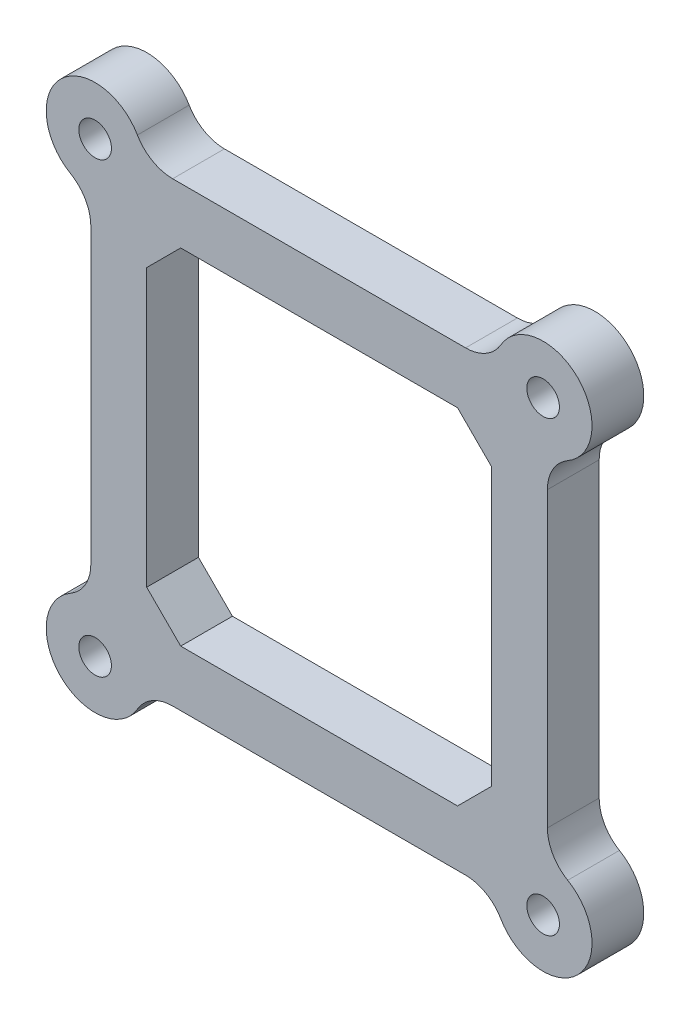
ISO-10303-21;
HEADER;
FILE_DESCRIPTION(('STEP AP214'),'2;1');
FILE_NAME('part.step','',(''),(''),'','','');
FILE_SCHEMA(('AUTOMOTIVE_DESIGN { 1 0 10303 214 1 1 1 1 }'));
ENDSEC;
DATA;
#1=APPLICATION_CONTEXT('core data for automotive mechanical design processes');
#2=APPLICATION_PROTOCOL_DEFINITION('international standard','automotive_design',2000,#1);
#3=PRODUCT_CONTEXT('',#1,'mechanical');
#4=PRODUCT('Part','Part','',(#3));
#5=PRODUCT_RELATED_PRODUCT_CATEGORY('part','',(#4));
#6=PRODUCT_DEFINITION_FORMATION('','',#4);
#7=PRODUCT_DEFINITION_CONTEXT('part definition',#1,'design');
#8=PRODUCT_DEFINITION('design','',#6,#7);
#9=PRODUCT_DEFINITION_SHAPE('','',#8);
#10=(LENGTH_UNIT() NAMED_UNIT(*) SI_UNIT(.MILLI.,.METRE.));
#11=(NAMED_UNIT(*) PLANE_ANGLE_UNIT() SI_UNIT($,.RADIAN.));
#12=(NAMED_UNIT(*) SI_UNIT($,.STERADIAN.) SOLID_ANGLE_UNIT());
#13=UNCERTAINTY_MEASURE_WITH_UNIT(LENGTH_MEASURE(1.E-05),#10,'distance_accuracy_value','');
#14=(GEOMETRIC_REPRESENTATION_CONTEXT(3) GLOBAL_UNCERTAINTY_ASSIGNED_CONTEXT((#13)) GLOBAL_UNIT_ASSIGNED_CONTEXT((#10,
#11,#12)) REPRESENTATION_CONTEXT('',''));
#15=CARTESIAN_POINT('',(0.,0.,0.));
#16=DIRECTION('',(0.,0.,1.));
#17=DIRECTION('',(1.,0.,0.));
#18=AXIS2_PLACEMENT_3D('',#15,#16,#17);
#19=CARTESIAN_POINT('',(0.,0.,6.35));
#20=DIRECTION('',(0.,0.,-1.));
#21=DIRECTION('',(-1.,0.,0.));
#22=AXIS2_PLACEMENT_3D('',#19,#20,#21);
#23=PLANE('',#22);
#24=CARTESIAN_POINT('',(-27.4766588878334,-27.4766588878335,6.35));
#25=DIRECTION('',(0.,0.,1.));
#26=DIRECTION('',(1.,0.,0.));
#27=AXIS2_PLACEMENT_3D('',#24,#25,#26);
#28=CIRCLE('',#27,2.00000000000001);
#29=CARTESIAN_POINT('',(-25.4766588878334,-27.4766588878335,6.35));
#30=VERTEX_POINT('',#29);
#31=EDGE_CURVE('E761',#30,#30,#28,.T.);
#32=ORIENTED_EDGE('',*,*,#31,.F.);
#33=EDGE_LOOP('',(#32));
#34=FACE_BOUND('',#33,.T.);
#35=CARTESIAN_POINT('',(27.4766588878334,-27.4766588878335,6.35));
#36=DIRECTION('',(0.,0.,1.));
#37=DIRECTION('',(1.,0.,0.));
#38=AXIS2_PLACEMENT_3D('',#35,#36,#37);
#39=CIRCLE('',#38,2.00000000000001);
#40=CARTESIAN_POINT('',(29.4766588878334,-27.4766588878335,6.35));
#41=VERTEX_POINT('',#40);
#42=EDGE_CURVE('E753',#41,#41,#39,.T.);
#43=ORIENTED_EDGE('',*,*,#42,.F.);
#44=EDGE_LOOP('',(#43));
#45=FACE_BOUND('',#44,.T.);
#46=CARTESIAN_POINT('',(27.4766588878334,27.4766588878335,6.35));
#47=DIRECTION('',(0.,0.,1.));
#48=DIRECTION('',(1.,0.,0.));
#49=AXIS2_PLACEMENT_3D('',#46,#47,#48);
#50=CIRCLE('',#49,2.00000000000001);
#51=CARTESIAN_POINT('',(29.4766588878334,27.4766588878335,6.35));
#52=VERTEX_POINT('',#51);
#53=EDGE_CURVE('E747',#52,#52,#50,.T.);
#54=ORIENTED_EDGE('',*,*,#53,.F.);
#55=EDGE_LOOP('',(#54));
#56=FACE_BOUND('',#55,.T.);
#57=CARTESIAN_POINT('',(-27.4766588878334,27.4766588878335,6.35));
#58=DIRECTION('',(0.,0.,1.));
#59=DIRECTION('',(1.,0.,0.));
#60=AXIS2_PLACEMENT_3D('',#57,#58,#59);
#61=CIRCLE('',#60,2.00000000000001);
#62=CARTESIAN_POINT('',(-25.4766588878334,27.4766588878335,6.35));
#63=VERTEX_POINT('',#62);
#64=EDGE_CURVE('E421',#63,#63,#61,.T.);
#65=ORIENTED_EDGE('',*,*,#64,.F.);
#66=EDGE_LOOP('',(#65));
#67=FACE_BOUND('',#66,.T.);
#68=CARTESIAN_POINT('',(-27.4766588878334,-27.4766588878335,6.35));
#69=DIRECTION('',(0.,0.,-1.));
#70=DIRECTION('',(-1.,0.,0.));
#71=AXIS2_PLACEMENT_3D('',#68,#69,#70);
#72=CIRCLE('',#71,6.00000000000001);
#73=CARTESIAN_POINT('',(-22.2895835698034,-30.4923262509695,6.35));
#74=VERTEX_POINT('',#73);
#75=CARTESIAN_POINT('',(-30.4923262509695,-22.2895835698035,6.35));
#76=VERTEX_POINT('',#75);
#77=EDGE_CURVE('E389',#74,#76,#72,.T.);
#78=ORIENTED_EDGE('',*,*,#77,.F.);
#79=CARTESIAN_POINT('',(-17.9670208047784,-33.0053823869162,6.35));
#80=DIRECTION('',(0.,0.,-1.));
#81=DIRECTION('',(-1.,0.,0.));
#82=AXIS2_PLACEMENT_3D('',#79,#80,#81);
#83=CIRCLE('',#82,5.);
#84=CARTESIAN_POINT('',(-17.9670208047784,-28.0053823869162,6.35));
#85=VERTEX_POINT('',#84);
#86=EDGE_CURVE('E344',#74,#85,#83,.T.);
#87=ORIENTED_EDGE('',*,*,#86,.T.);
#88=DIRECTION('',(1.,0.,0.));
#89=VECTOR('',#88,1.);
#90=CARTESIAN_POINT('',(21.5,-28.0053823869162,6.35));
#91=LINE('',#90,#89);
#92=CARTESIAN_POINT('',(17.9670208047784,-28.0053823869162,6.35));
#93=VERTEX_POINT('',#92);
#94=EDGE_CURVE('E270',#85,#93,#91,.T.);
#95=ORIENTED_EDGE('',*,*,#94,.T.);
#96=CARTESIAN_POINT('',(17.9670208047784,-33.0053823869162,6.35));
#97=DIRECTION('',(0.,0.,-1.));
#98=DIRECTION('',(-1.,0.,0.));
#99=AXIS2_PLACEMENT_3D('',#96,#97,#98);
#100=CIRCLE('',#99,5.);
#101=CARTESIAN_POINT('',(22.2895835698034,-30.4923262509695,6.35));
#102=VERTEX_POINT('',#101);
#103=EDGE_CURVE('E340',#93,#102,#100,.T.);
#104=ORIENTED_EDGE('',*,*,#103,.T.);
#105=CARTESIAN_POINT('',(27.4766588878334,-27.4766588878335,6.35));
#106=DIRECTION('',(0.,0.,-1.));
#107=DIRECTION('',(-1.,0.,0.));
#108=AXIS2_PLACEMENT_3D('',#105,#106,#107);
#109=CIRCLE('',#108,6.00000000000001);
#110=CARTESIAN_POINT('',(30.4923262509695,-22.2895835698035,6.35));
#111=VERTEX_POINT('',#110);
#112=EDGE_CURVE('E416',#102,#111,#109,.F.);
#113=ORIENTED_EDGE('',*,*,#112,.T.);
#114=CARTESIAN_POINT('',(33.0053823869162,-17.9670208047785,6.35));
#115=DIRECTION('',(0.,0.,-1.));
#116=DIRECTION('',(-1.,0.,0.));
#117=AXIS2_PLACEMENT_3D('',#114,#115,#116);
#118=CIRCLE('',#117,5.);
#119=CARTESIAN_POINT('',(28.0053823869162,-17.9670208047785,6.35));
#120=VERTEX_POINT('',#119);
#121=EDGE_CURVE('E336',#111,#120,#118,.T.);
#122=ORIENTED_EDGE('',*,*,#121,.T.);
#123=DIRECTION('',(0.,1.,0.));
#124=VECTOR('',#123,1.);
#125=CARTESIAN_POINT('',(28.0053823869162,21.5,6.35));
#126=LINE('',#125,#124);
#127=CARTESIAN_POINT('',(28.0053823869162,17.9670208047785,6.35));
#128=VERTEX_POINT('',#127);
#129=EDGE_CURVE('E273',#120,#128,#126,.T.);
#130=ORIENTED_EDGE('',*,*,#129,.T.);
#131=CARTESIAN_POINT('',(33.0053823869162,17.9670208047785,6.35));
#132=DIRECTION('',(0.,0.,-1.));
#133=DIRECTION('',(-1.,0.,0.));
#134=AXIS2_PLACEMENT_3D('',#131,#132,#133);
#135=CIRCLE('',#134,5.);
#136=CARTESIAN_POINT('',(30.4923262509695,22.2895835698035,6.35));
#137=VERTEX_POINT('',#136);
#138=EDGE_CURVE('E332',#128,#137,#135,.T.);
#139=ORIENTED_EDGE('',*,*,#138,.T.);
#140=CARTESIAN_POINT('',(27.4766588878334,27.4766588878335,6.35));
#141=DIRECTION('',(0.,0.,-1.));
#142=DIRECTION('',(-1.,0.,0.));
#143=AXIS2_PLACEMENT_3D('',#140,#141,#142);
#144=CIRCLE('',#143,6.00000000000001);
#145=CARTESIAN_POINT('',(22.2895835698034,30.4923262509695,6.35));
#146=VERTEX_POINT('',#145);
#147=EDGE_CURVE('E239',#146,#137,#144,.T.);
#148=ORIENTED_EDGE('',*,*,#147,.F.);
#149=CARTESIAN_POINT('',(17.9670208047784,33.0053823869162,6.35));
#150=DIRECTION('',(0.,0.,-1.));
#151=DIRECTION('',(-1.,0.,0.));
#152=AXIS2_PLACEMENT_3D('',#149,#150,#151);
#153=CIRCLE('',#152,5.);
#154=CARTESIAN_POINT('',(17.9670208047784,28.0053823869162,6.35));
#155=VERTEX_POINT('',#154);
#156=EDGE_CURVE('E11',#146,#155,#153,.T.);
#157=ORIENTED_EDGE('',*,*,#156,.T.);
#158=DIRECTION('',(-1.,0.,0.));
#159=VECTOR('',#158,1.);
#160=CARTESIAN_POINT('',(-21.5,28.0053823869162,6.35));
#161=LINE('',#160,#159);
#162=CARTESIAN_POINT('',(-17.9670208047784,28.0053823869162,6.35));
#163=VERTEX_POINT('',#162);
#164=EDGE_CURVE('E277',#155,#163,#161,.T.);
#165=ORIENTED_EDGE('',*,*,#164,.T.);
#166=CARTESIAN_POINT('',(-17.9670208047784,33.0053823869162,6.35));
#167=DIRECTION('',(0.,0.,-1.));
#168=DIRECTION('',(-1.,0.,0.));
#169=AXIS2_PLACEMENT_3D('',#166,#167,#168);
#170=CIRCLE('',#169,5.);
#171=CARTESIAN_POINT('',(-22.2895835698034,30.4923262509695,6.35));
#172=VERTEX_POINT('',#171);
#173=EDGE_CURVE('E356',#163,#172,#170,.T.);
#174=ORIENTED_EDGE('',*,*,#173,.T.);
#175=CARTESIAN_POINT('',(-27.4766588878334,27.4766588878335,6.35));
#176=DIRECTION('',(0.,0.,-1.));
#177=DIRECTION('',(-1.,0.,0.));
#178=AXIS2_PLACEMENT_3D('',#175,#176,#177);
#179=CIRCLE('',#178,6.00000000000001);
#180=CARTESIAN_POINT('',(-30.4923262509695,22.2895835698035,6.35));
#181=VERTEX_POINT('',#180);
#182=EDGE_CURVE('E372',#172,#181,#179,.F.);
#183=ORIENTED_EDGE('',*,*,#182,.T.);
#184=CARTESIAN_POINT('',(-33.0053823869162,17.9670208047785,6.35));
#185=DIRECTION('',(0.,0.,-1.));
#186=DIRECTION('',(-1.,0.,0.));
#187=AXIS2_PLACEMENT_3D('',#184,#185,#186);
#188=CIRCLE('',#187,5.);
#189=CARTESIAN_POINT('',(-28.0053823869162,17.9670208047785,6.35));
#190=VERTEX_POINT('',#189);
#191=EDGE_CURVE('E352',#181,#190,#188,.T.);
#192=ORIENTED_EDGE('',*,*,#191,.T.);
#193=DIRECTION('',(0.,-1.,0.));
#194=VECTOR('',#193,1.);
#195=CARTESIAN_POINT('',(-28.0053823869162,-21.5,6.35));
#196=LINE('',#195,#194);
#197=CARTESIAN_POINT('',(-28.0053823869162,-17.9670208047785,6.35));
#198=VERTEX_POINT('',#197);
#199=EDGE_CURVE('E279',#190,#198,#196,.T.);
#200=ORIENTED_EDGE('',*,*,#199,.T.);
#201=CARTESIAN_POINT('',(-33.0053823869162,-17.9670208047785,6.35));
#202=DIRECTION('',(0.,0.,-1.));
#203=DIRECTION('',(-1.,0.,0.));
#204=AXIS2_PLACEMENT_3D('',#201,#202,#203);
#205=CIRCLE('',#204,5.);
#206=EDGE_CURVE('E348',#198,#76,#205,.T.);
#207=ORIENTED_EDGE('',*,*,#206,.T.);
#208=EDGE_LOOP('',(#78,#87,#95,#104,#113,#122,#130,#139,#148,#157,#165,#174,#183,#192,#200,#207));
#209=FACE_BOUND('',#208,.T.);
#210=DIRECTION('',(1.,0.,0.));
#211=VECTOR('',#210,1.);
#212=CARTESIAN_POINT('',(16.9780699909994,-21.15,6.35));
#213=LINE('',#212,#211);
#214=CARTESIAN_POINT('',(-16.9780699909994,-21.15,6.35));
#215=VERTEX_POINT('',#214);
#216=CARTESIAN_POINT('',(16.9780699909994,-21.15,6.35));
#217=VERTEX_POINT('',#216);
#218=EDGE_CURVE('E198',#215,#217,#213,.T.);
#219=ORIENTED_EDGE('',*,*,#218,.F.);
#220=DIRECTION('',(0.707106781186548,-0.707106781186548,0.));
#221=VECTOR('',#220,1.);
#222=CARTESIAN_POINT('',(-16.9780699909994,-21.15,6.35));
#223=LINE('',#222,#221);
#224=CARTESIAN_POINT('',(-21.15,-16.9780699909994,6.35));
#225=VERTEX_POINT('',#224);
#226=EDGE_CURVE('E235',#225,#215,#223,.T.);
#227=ORIENTED_EDGE('',*,*,#226,.F.);
#228=DIRECTION('',(0.,-1.,0.));
#229=VECTOR('',#228,1.);
#230=CARTESIAN_POINT('',(-21.15,-16.9780699909994,6.35));
#231=LINE('',#230,#229);
#232=CARTESIAN_POINT('',(-21.15,16.9780699909994,6.35));
#233=VERTEX_POINT('',#232);
#234=EDGE_CURVE('E232',#233,#225,#231,.T.);
#235=ORIENTED_EDGE('',*,*,#234,.F.);
#236=DIRECTION('',(-0.707106781186548,-0.707106781186548,0.));
#237=VECTOR('',#236,1.);
#238=CARTESIAN_POINT('',(-21.15,16.9780699909994,6.35));
#239=LINE('',#238,#237);
#240=CARTESIAN_POINT('',(-16.9780699909994,21.15,6.35));
#241=VERTEX_POINT('',#240);
#242=EDGE_CURVE('E230',#241,#233,#239,.T.);
#243=ORIENTED_EDGE('',*,*,#242,.F.);
#244=DIRECTION('',(-1.,0.,0.));
#245=VECTOR('',#244,1.);
#246=CARTESIAN_POINT('',(-16.9780699909994,21.15,6.35));
#247=LINE('',#246,#245);
#248=CARTESIAN_POINT('',(16.9780699909994,21.15,6.35));
#249=VERTEX_POINT('',#248);
#250=EDGE_CURVE('E228',#249,#241,#247,.T.);
#251=ORIENTED_EDGE('',*,*,#250,.F.);
#252=DIRECTION('',(-0.707106781186548,0.707106781186548,0.));
#253=VECTOR('',#252,1.);
#254=CARTESIAN_POINT('',(16.9780699909994,21.15,6.35));
#255=LINE('',#254,#253);
#256=CARTESIAN_POINT('',(21.15,16.9780699909994,6.35));
#257=VERTEX_POINT('',#256);
#258=EDGE_CURVE('E223',#257,#249,#255,.T.);
#259=ORIENTED_EDGE('',*,*,#258,.F.);
#260=DIRECTION('',(0.,1.,0.));
#261=VECTOR('',#260,1.);
#262=CARTESIAN_POINT('',(21.15,16.9780699909994,6.35));
#263=LINE('',#262,#261);
#264=CARTESIAN_POINT('',(21.15,-16.9780699909994,6.35));
#265=VERTEX_POINT('',#264);
#266=EDGE_CURVE('E221',#265,#257,#263,.T.);
#267=ORIENTED_EDGE('',*,*,#266,.F.);
#268=DIRECTION('',(0.707106781186548,0.707106781186548,0.));
#269=VECTOR('',#268,1.);
#270=CARTESIAN_POINT('',(21.15,-16.9780699909994,6.35));
#271=LINE('',#270,#269);
#272=EDGE_CURVE('E208',#217,#265,#271,.T.);
#273=ORIENTED_EDGE('',*,*,#272,.F.);
#274=EDGE_LOOP('',(#219,#227,#235,#243,#251,#259,#267,#273));
#275=FACE_BOUND('',#274,.T.);
#276=ADVANCED_FACE('F36',(#34,#45,#56,#67,#209,#275),#23,.F.);
#277=CARTESIAN_POINT('',(0.,0.,0.));
#278=DIRECTION('',(0.,0.,-1.));
#279=DIRECTION('',(-1.,0.,0.));
#280=AXIS2_PLACEMENT_3D('',#277,#278,#279);
#281=PLANE('',#280);
#282=CARTESIAN_POINT('',(-27.4766588878334,-27.4766588878335,0.));
#283=DIRECTION('',(0.,0.,1.));
#284=DIRECTION('',(1.,0.,0.));
#285=AXIS2_PLACEMENT_3D('',#282,#283,#284);
#286=CIRCLE('',#285,2.00000000000001);
#287=CARTESIAN_POINT('',(-25.4766588878334,-27.4766588878335,0.));
#288=VERTEX_POINT('',#287);
#289=EDGE_CURVE('E758',#288,#288,#286,.T.);
#290=ORIENTED_EDGE('',*,*,#289,.T.);
#291=EDGE_LOOP('',(#290));
#292=FACE_BOUND('',#291,.T.);
#293=CARTESIAN_POINT('',(27.4766588878334,-27.4766588878335,0.));
#294=DIRECTION('',(0.,0.,1.));
#295=DIRECTION('',(1.,0.,0.));
#296=AXIS2_PLACEMENT_3D('',#293,#294,#295);
#297=CIRCLE('',#296,2.00000000000001);
#298=CARTESIAN_POINT('',(29.4766588878334,-27.4766588878335,0.));
#299=VERTEX_POINT('',#298);
#300=EDGE_CURVE('E749',#299,#299,#297,.T.);
#301=ORIENTED_EDGE('',*,*,#300,.T.);
#302=EDGE_LOOP('',(#301));
#303=FACE_BOUND('',#302,.T.);
#304=CARTESIAN_POINT('',(27.4766588878334,27.4766588878335,0.));
#305=DIRECTION('',(0.,0.,1.));
#306=DIRECTION('',(1.,0.,0.));
#307=AXIS2_PLACEMENT_3D('',#304,#305,#306);
#308=CIRCLE('',#307,2.00000000000001);
#309=CARTESIAN_POINT('',(29.4766588878334,27.4766588878335,0.));
#310=VERTEX_POINT('',#309);
#311=EDGE_CURVE('E744',#310,#310,#308,.T.);
#312=ORIENTED_EDGE('',*,*,#311,.T.);
#313=EDGE_LOOP('',(#312));
#314=FACE_BOUND('',#313,.T.);
#315=CARTESIAN_POINT('',(-27.4766588878334,27.4766588878335,0.));
#316=DIRECTION('',(0.,0.,1.));
#317=DIRECTION('',(1.,0.,0.));
#318=AXIS2_PLACEMENT_3D('',#315,#316,#317);
#319=CIRCLE('',#318,2.00000000000001);
#320=CARTESIAN_POINT('',(-25.4766588878334,27.4766588878335,0.));
#321=VERTEX_POINT('',#320);
#322=EDGE_CURVE('E417',#321,#321,#319,.T.);
#323=ORIENTED_EDGE('',*,*,#322,.T.);
#324=EDGE_LOOP('',(#323));
#325=FACE_BOUND('',#324,.T.);
#326=DIRECTION('',(0.,1.,0.));
#327=VECTOR('',#326,1.);
#328=CARTESIAN_POINT('',(28.0053823869162,21.5,0.));
#329=LINE('',#328,#327);
#330=CARTESIAN_POINT('',(28.0053823869162,-17.9670208047785,0.));
#331=VERTEX_POINT('',#330);
#332=CARTESIAN_POINT('',(28.0053823869162,17.9670208047785,0.));
#333=VERTEX_POINT('',#332);
#334=EDGE_CURVE('E285',#331,#333,#329,.T.);
#335=ORIENTED_EDGE('',*,*,#334,.F.);
#336=CARTESIAN_POINT('',(33.0053823869162,-17.9670208047785,0.));
#337=DIRECTION('',(0.,0.,-1.));
#338=DIRECTION('',(-1.,0.,0.));
#339=AXIS2_PLACEMENT_3D('',#336,#337,#338);
#340=CIRCLE('',#339,5.);
#341=CARTESIAN_POINT('',(30.4923262509695,-22.2895835698035,0.));
#342=VERTEX_POINT('',#341);
#343=EDGE_CURVE('E334',#331,#342,#340,.F.);
#344=ORIENTED_EDGE('',*,*,#343,.T.);
#345=CARTESIAN_POINT('',(27.4766588878334,-27.4766588878335,0.));
#346=DIRECTION('',(0.,0.,-1.));
#347=DIRECTION('',(1.,0.,0.));
#348=AXIS2_PLACEMENT_3D('',#345,#346,#347);
#349=CIRCLE('',#348,6.00000000000001);
#350=CARTESIAN_POINT('',(22.2895835698034,-30.4923262509695,0.));
#351=VERTEX_POINT('',#350);
#352=EDGE_CURVE('E410',#342,#351,#349,.T.);
#353=ORIENTED_EDGE('',*,*,#352,.T.);
#354=CARTESIAN_POINT('',(17.9670208047784,-33.0053823869162,0.));
#355=DIRECTION('',(0.,0.,-1.));
#356=DIRECTION('',(-1.,0.,0.));
#357=AXIS2_PLACEMENT_3D('',#354,#355,#356);
#358=CIRCLE('',#357,5.);
#359=CARTESIAN_POINT('',(17.9670208047784,-28.0053823869162,0.));
#360=VERTEX_POINT('',#359);
#361=EDGE_CURVE('E338',#351,#360,#358,.F.);
#362=ORIENTED_EDGE('',*,*,#361,.T.);
#363=DIRECTION('',(1.,0.,0.));
#364=VECTOR('',#363,1.);
#365=CARTESIAN_POINT('',(21.5,-28.0053823869162,0.));
#366=LINE('',#365,#364);
#367=CARTESIAN_POINT('',(-17.9670208047784,-28.0053823869162,0.));
#368=VERTEX_POINT('',#367);
#369=EDGE_CURVE('E216',#368,#360,#366,.T.);
#370=ORIENTED_EDGE('',*,*,#369,.F.);
#371=CARTESIAN_POINT('',(-17.9670208047784,-33.0053823869162,0.));
#372=DIRECTION('',(0.,0.,-1.));
#373=DIRECTION('',(-1.,0.,0.));
#374=AXIS2_PLACEMENT_3D('',#371,#372,#373);
#375=CIRCLE('',#374,5.);
#376=CARTESIAN_POINT('',(-22.2895835698034,-30.4923262509695,0.));
#377=VERTEX_POINT('',#376);
#378=EDGE_CURVE('E342',#368,#377,#375,.F.);
#379=ORIENTED_EDGE('',*,*,#378,.T.);
#380=CARTESIAN_POINT('',(-27.4766588878334,-27.4766588878335,0.));
#381=DIRECTION('',(0.,0.,1.));
#382=DIRECTION('',(-1.,0.,0.));
#383=AXIS2_PLACEMENT_3D('',#380,#381,#382);
#384=CIRCLE('',#383,6.00000000000001);
#385=CARTESIAN_POINT('',(-30.4923262509695,-22.2895835698035,0.));
#386=VERTEX_POINT('',#385);
#387=EDGE_CURVE('E393',#386,#377,#384,.T.);
#388=ORIENTED_EDGE('',*,*,#387,.F.);
#389=CARTESIAN_POINT('',(-33.0053823869162,-17.9670208047785,0.));
#390=DIRECTION('',(0.,0.,-1.));
#391=DIRECTION('',(-1.,0.,0.));
#392=AXIS2_PLACEMENT_3D('',#389,#390,#391);
#393=CIRCLE('',#392,5.);
#394=CARTESIAN_POINT('',(-28.0053823869162,-17.9670208047785,0.));
#395=VERTEX_POINT('',#394);
#396=EDGE_CURVE('E346',#386,#395,#393,.F.);
#397=ORIENTED_EDGE('',*,*,#396,.T.);
#398=DIRECTION('',(0.,-1.,0.));
#399=VECTOR('',#398,1.);
#400=CARTESIAN_POINT('',(-28.0053823869162,-21.5,0.));
#401=LINE('',#400,#399);
#402=CARTESIAN_POINT('',(-28.0053823869162,17.9670208047785,0.));
#403=VERTEX_POINT('',#402);
#404=EDGE_CURVE('E274',#403,#395,#401,.T.);
#405=ORIENTED_EDGE('',*,*,#404,.F.);
#406=CARTESIAN_POINT('',(-33.0053823869162,17.9670208047785,0.));
#407=DIRECTION('',(0.,0.,-1.));
#408=DIRECTION('',(-1.,0.,0.));
#409=AXIS2_PLACEMENT_3D('',#406,#407,#408);
#410=CIRCLE('',#409,5.);
#411=CARTESIAN_POINT('',(-30.4923262509695,22.2895835698035,0.));
#412=VERTEX_POINT('',#411);
#413=EDGE_CURVE('E350',#403,#412,#410,.F.);
#414=ORIENTED_EDGE('',*,*,#413,.T.);
#415=CARTESIAN_POINT('',(-27.4766588878334,27.4766588878335,0.));
#416=DIRECTION('',(0.,0.,-1.));
#417=DIRECTION('',(-1.,0.,0.));
#418=AXIS2_PLACEMENT_3D('',#415,#416,#417);
#419=CIRCLE('',#418,6.00000000000001);
#420=CARTESIAN_POINT('',(-22.2895835698034,30.4923262509695,0.));
#421=VERTEX_POINT('',#420);
#422=EDGE_CURVE('E386',#412,#421,#419,.T.);
#423=ORIENTED_EDGE('',*,*,#422,.T.);
#424=CARTESIAN_POINT('',(-17.9670208047784,33.0053823869162,0.));
#425=DIRECTION('',(0.,0.,-1.));
#426=DIRECTION('',(-1.,0.,0.));
#427=AXIS2_PLACEMENT_3D('',#424,#425,#426);
#428=CIRCLE('',#427,5.);
#429=CARTESIAN_POINT('',(-17.9670208047784,28.0053823869162,0.));
#430=VERTEX_POINT('',#429);
#431=EDGE_CURVE('E354',#421,#430,#428,.F.);
#432=ORIENTED_EDGE('',*,*,#431,.T.);
#433=DIRECTION('',(-1.,0.,0.));
#434=VECTOR('',#433,1.);
#435=CARTESIAN_POINT('',(-21.5,28.0053823869162,0.));
#436=LINE('',#435,#434);
#437=CARTESIAN_POINT('',(17.9670208047784,28.0053823869162,0.));
#438=VERTEX_POINT('',#437);
#439=EDGE_CURVE('E288',#438,#430,#436,.T.);
#440=ORIENTED_EDGE('',*,*,#439,.F.);
#441=CARTESIAN_POINT('',(17.9670208047784,33.0053823869162,0.));
#442=DIRECTION('',(0.,0.,-1.));
#443=DIRECTION('',(-1.,0.,0.));
#444=AXIS2_PLACEMENT_3D('',#441,#442,#443);
#445=CIRCLE('',#444,5.);
#446=CARTESIAN_POINT('',(22.2895835698034,30.4923262509695,0.));
#447=VERTEX_POINT('',#446);
#448=EDGE_CURVE('E44',#438,#447,#445,.F.);
#449=ORIENTED_EDGE('',*,*,#448,.T.);
#450=CARTESIAN_POINT('',(27.4766588878334,27.4766588878335,0.));
#451=DIRECTION('',(0.,0.,1.));
#452=DIRECTION('',(1.,0.,0.));
#453=AXIS2_PLACEMENT_3D('',#450,#451,#452);
#454=CIRCLE('',#453,6.00000000000001);
#455=CARTESIAN_POINT('',(30.4923262509695,22.2895835698035,0.));
#456=VERTEX_POINT('',#455);
#457=EDGE_CURVE('E364',#456,#447,#454,.T.);
#458=ORIENTED_EDGE('',*,*,#457,.F.);
#459=CARTESIAN_POINT('',(33.0053823869162,17.9670208047785,0.));
#460=DIRECTION('',(0.,0.,-1.));
#461=DIRECTION('',(-1.,0.,0.));
#462=AXIS2_PLACEMENT_3D('',#459,#460,#461);
#463=CIRCLE('',#462,5.);
#464=EDGE_CURVE('E330',#456,#333,#463,.F.);
#465=ORIENTED_EDGE('',*,*,#464,.T.);
#466=EDGE_LOOP('',(#335,#344,#353,#362,#370,#379,#388,#397,#405,#414,#423,#432,#440,#449,#458,#465));
#467=FACE_BOUND('',#466,.T.);
#468=DIRECTION('',(0.707106781186548,-0.707106781186548,0.));
#469=VECTOR('',#468,1.);
#470=CARTESIAN_POINT('',(-16.9780699909994,-21.15,0.));
#471=LINE('',#470,#469);
#472=CARTESIAN_POINT('',(-21.15,-16.9780699909994,0.));
#473=VERTEX_POINT('',#472);
#474=CARTESIAN_POINT('',(-16.9780699909994,-21.15,0.));
#475=VERTEX_POINT('',#474);
#476=EDGE_CURVE('E209',#473,#475,#471,.T.);
#477=ORIENTED_EDGE('',*,*,#476,.T.);
#478=DIRECTION('',(1.,0.,0.));
#479=VECTOR('',#478,1.);
#480=CARTESIAN_POINT('',(16.9780699909994,-21.15,0.));
#481=LINE('',#480,#479);
#482=CARTESIAN_POINT('',(16.9780699909994,-21.15,0.));
#483=VERTEX_POINT('',#482);
#484=EDGE_CURVE('E237',#475,#483,#481,.T.);
#485=ORIENTED_EDGE('',*,*,#484,.T.);
#486=DIRECTION('',(0.707106781186548,0.707106781186548,0.));
#487=VECTOR('',#486,1.);
#488=CARTESIAN_POINT('',(21.15,-16.9780699909994,0.));
#489=LINE('',#488,#487);
#490=CARTESIAN_POINT('',(21.15,-16.9780699909994,0.));
#491=VERTEX_POINT('',#490);
#492=EDGE_CURVE('E215',#483,#491,#489,.T.);
#493=ORIENTED_EDGE('',*,*,#492,.T.);
#494=DIRECTION('',(0.,1.,0.));
#495=VECTOR('',#494,1.);
#496=CARTESIAN_POINT('',(21.15,16.9780699909994,0.));
#497=LINE('',#496,#495);
#498=CARTESIAN_POINT('',(21.15,16.9780699909994,0.));
#499=VERTEX_POINT('',#498);
#500=EDGE_CURVE('E241',#491,#499,#497,.T.);
#501=ORIENTED_EDGE('',*,*,#500,.T.);
#502=DIRECTION('',(-0.707106781186548,0.707106781186548,0.));
#503=VECTOR('',#502,1.);
#504=CARTESIAN_POINT('',(16.9780699909994,21.15,0.));
#505=LINE('',#504,#503);
#506=CARTESIAN_POINT('',(16.9780699909994,21.15,0.));
#507=VERTEX_POINT('',#506);
#508=EDGE_CURVE('E244',#499,#507,#505,.T.);
#509=ORIENTED_EDGE('',*,*,#508,.T.);
#510=DIRECTION('',(-1.,0.,0.));
#511=VECTOR('',#510,1.);
#512=CARTESIAN_POINT('',(-16.9780699909994,21.15,0.));
#513=LINE('',#512,#511);
#514=CARTESIAN_POINT('',(-16.9780699909994,21.15,0.));
#515=VERTEX_POINT('',#514);
#516=EDGE_CURVE('E247',#507,#515,#513,.T.);
#517=ORIENTED_EDGE('',*,*,#516,.T.);
#518=DIRECTION('',(-0.707106781186548,-0.707106781186548,0.));
#519=VECTOR('',#518,1.);
#520=CARTESIAN_POINT('',(-21.15,16.9780699909994,0.));
#521=LINE('',#520,#519);
#522=CARTESIAN_POINT('',(-21.15,16.9780699909994,0.));
#523=VERTEX_POINT('',#522);
#524=EDGE_CURVE('E250',#515,#523,#521,.T.);
#525=ORIENTED_EDGE('',*,*,#524,.T.);
#526=DIRECTION('',(0.,-1.,0.));
#527=VECTOR('',#526,1.);
#528=CARTESIAN_POINT('',(-21.15,-16.9780699909994,0.));
#529=LINE('',#528,#527);
#530=EDGE_CURVE('E253',#523,#473,#529,.T.);
#531=ORIENTED_EDGE('',*,*,#530,.T.);
#532=EDGE_LOOP('',(#477,#485,#493,#501,#509,#517,#525,#531));
#533=FACE_BOUND('',#532,.T.);
#534=ADVANCED_FACE('F362',(#292,#303,#314,#325,#467,#533),#281,.T.);
#535=CARTESIAN_POINT('',(21.5,-28.0053823869162,6.35));
#536=DIRECTION('',(0.,1.,0.));
#537=DIRECTION('',(0.,0.,1.));
#538=AXIS2_PLACEMENT_3D('',#535,#536,#537);
#539=PLANE('',#538);
#540=ORIENTED_EDGE('',*,*,#369,.T.);
#541=DIRECTION('',(0.,0.,-1.));
#542=VECTOR('',#541,1.);
#543=CARTESIAN_POINT('',(17.9670208047784,-28.0053823869162,6.35));
#544=LINE('',#543,#542);
#545=EDGE_CURVE('E309',#360,#93,#544,.F.);
#546=ORIENTED_EDGE('',*,*,#545,.T.);
#547=ORIENTED_EDGE('',*,*,#94,.F.);
#548=DIRECTION('',(0.,0.,1.));
#549=VECTOR('',#548,1.);
#550=CARTESIAN_POINT('',(-17.9670208047784,-28.0053823869162,0.));
#551=LINE('',#550,#549);
#552=EDGE_CURVE('E306',#85,#368,#551,.F.);
#553=ORIENTED_EDGE('',*,*,#552,.T.);
#554=EDGE_LOOP('',(#540,#546,#547,#553));
#555=FACE_BOUND('',#554,.T.);
#556=ADVANCED_FACE('F437',(#555),#539,.F.);
#557=CARTESIAN_POINT('',(28.0053823869162,21.5,6.35));
#558=DIRECTION('',(-1.,0.,0.));
#559=DIRECTION('',(0.,0.,1.));
#560=AXIS2_PLACEMENT_3D('',#557,#558,#559);
#561=PLANE('',#560);
#562=ORIENTED_EDGE('',*,*,#334,.T.);
#563=DIRECTION('',(0.,0.,1.));
#564=VECTOR('',#563,1.);
#565=CARTESIAN_POINT('',(28.0053823869162,17.9670208047785,6.35000000000001));
#566=LINE('',#565,#564);
#567=EDGE_CURVE('E299',#333,#128,#566,.T.);
#568=ORIENTED_EDGE('',*,*,#567,.T.);
#569=ORIENTED_EDGE('',*,*,#129,.F.);
#570=DIRECTION('',(0.,0.,-1.));
#571=VECTOR('',#570,1.);
#572=CARTESIAN_POINT('',(28.0053823869162,-17.9670208047785,6.35));
#573=LINE('',#572,#571);
#574=EDGE_CURVE('E296',#120,#331,#573,.T.);
#575=ORIENTED_EDGE('',*,*,#574,.T.);
#576=EDGE_LOOP('',(#562,#568,#569,#575));
#577=FACE_BOUND('',#576,.T.);
#578=ADVANCED_FACE('F401',(#577),#561,.F.);
#579=CARTESIAN_POINT('',(-21.5,28.0053823869162,6.35));
#580=DIRECTION('',(0.,-1.,0.));
#581=DIRECTION('',(0.,0.,-1.));
#582=AXIS2_PLACEMENT_3D('',#579,#580,#581);
#583=PLANE('',#582);
#584=ORIENTED_EDGE('',*,*,#439,.T.);
#585=DIRECTION('',(0.,0.,-1.));
#586=VECTOR('',#585,1.);
#587=CARTESIAN_POINT('',(-17.9670208047784,28.0053823869162,6.35));
#588=LINE('',#587,#586);
#589=EDGE_CURVE('E51',#430,#163,#588,.F.);
#590=ORIENTED_EDGE('',*,*,#589,.T.);
#591=ORIENTED_EDGE('',*,*,#164,.F.);
#592=DIRECTION('',(0.,0.,1.));
#593=VECTOR('',#592,1.);
#594=CARTESIAN_POINT('',(17.9670208047784,28.0053823869162,0.));
#595=LINE('',#594,#593);
#596=EDGE_CURVE('E326',#155,#438,#595,.F.);
#597=ORIENTED_EDGE('',*,*,#596,.T.);
#598=EDGE_LOOP('',(#584,#590,#591,#597));
#599=FACE_BOUND('',#598,.T.);
#600=ADVANCED_FACE('F374',(#599),#583,.F.);
#601=CARTESIAN_POINT('',(-28.0053823869162,-21.5,6.35));
#602=DIRECTION('',(1.,0.,0.));
#603=DIRECTION('',(0.,0.,-1.));
#604=AXIS2_PLACEMENT_3D('',#601,#602,#603);
#605=PLANE('',#604);
#606=ORIENTED_EDGE('',*,*,#404,.T.);
#607=DIRECTION('',(0.,0.,1.));
#608=VECTOR('',#607,1.);
#609=CARTESIAN_POINT('',(-28.0053823869162,-17.9670208047785,6.35000000000001));
#610=LINE('',#609,#608);
#611=EDGE_CURVE('E319',#395,#198,#610,.T.);
#612=ORIENTED_EDGE('',*,*,#611,.T.);
#613=ORIENTED_EDGE('',*,*,#199,.F.);
#614=DIRECTION('',(0.,0.,-1.));
#615=VECTOR('',#614,1.);
#616=CARTESIAN_POINT('',(-28.0053823869162,17.9670208047785,6.35));
#617=LINE('',#616,#615);
#618=EDGE_CURVE('E316',#190,#403,#617,.T.);
#619=ORIENTED_EDGE('',*,*,#618,.T.);
#620=EDGE_LOOP('',(#606,#612,#613,#619));
#621=FACE_BOUND('',#620,.T.);
#622=ADVANCED_FACE('F464',(#621),#605,.F.);
#623=CARTESIAN_POINT('',(16.9780699909994,-21.15,6.35));
#624=DIRECTION('',(0.,1.,0.));
#625=DIRECTION('',(0.,0.,1.));
#626=AXIS2_PLACEMENT_3D('',#623,#624,#625);
#627=PLANE('',#626);
#628=ORIENTED_EDGE('',*,*,#484,.F.);
#629=DIRECTION('',(0.,0.,-1.));
#630=VECTOR('',#629,1.);
#631=CARTESIAN_POINT('',(-16.9780699909994,-21.15,6.35));
#632=LINE('',#631,#630);
#633=EDGE_CURVE('E204',#215,#475,#632,.T.);
#634=ORIENTED_EDGE('',*,*,#633,.F.);
#635=ORIENTED_EDGE('',*,*,#218,.T.);
#636=DIRECTION('',(0.,0.,-1.));
#637=VECTOR('',#636,1.);
#638=CARTESIAN_POINT('',(16.9780699909994,-21.15,6.35));
#639=LINE('',#638,#637);
#640=EDGE_CURVE('E201',#217,#483,#639,.T.);
#641=ORIENTED_EDGE('',*,*,#640,.T.);
#642=EDGE_LOOP('',(#628,#634,#635,#641));
#643=FACE_BOUND('',#642,.T.);
#644=ADVANCED_FACE('F200',(#643),#627,.T.);
#645=CARTESIAN_POINT('',(21.15,-16.9780699909994,6.35));
#646=DIRECTION('',(-0.707106781186548,0.707106781186548,0.));
#647=DIRECTION('',(-0.707106781186548,-0.707106781186548,0.));
#648=AXIS2_PLACEMENT_3D('',#645,#646,#647);
#649=PLANE('',#648);
#650=ORIENTED_EDGE('',*,*,#492,.F.);
#651=ORIENTED_EDGE('',*,*,#640,.F.);
#652=ORIENTED_EDGE('',*,*,#272,.T.);
#653=DIRECTION('',(0.,0.,-1.));
#654=VECTOR('',#653,1.);
#655=CARTESIAN_POINT('',(21.15,-16.9780699909994,6.35));
#656=LINE('',#655,#654);
#657=EDGE_CURVE('E217',#265,#491,#656,.T.);
#658=ORIENTED_EDGE('',*,*,#657,.T.);
#659=EDGE_LOOP('',(#650,#651,#652,#658));
#660=FACE_BOUND('',#659,.T.);
#661=ADVANCED_FACE('F212',(#660),#649,.T.);
#662=CARTESIAN_POINT('',(21.15,16.9780699909994,6.35));
#663=DIRECTION('',(-1.,0.,0.));
#664=DIRECTION('',(0.,0.,1.));
#665=AXIS2_PLACEMENT_3D('',#662,#663,#664);
#666=PLANE('',#665);
#667=ORIENTED_EDGE('',*,*,#500,.F.);
#668=ORIENTED_EDGE('',*,*,#657,.F.);
#669=ORIENTED_EDGE('',*,*,#266,.T.);
#670=DIRECTION('',(0.,0.,-1.));
#671=VECTOR('',#670,1.);
#672=CARTESIAN_POINT('',(21.15,16.9780699909994,6.35));
#673=LINE('',#672,#671);
#674=EDGE_CURVE('E267',#257,#499,#673,.T.);
#675=ORIENTED_EDGE('',*,*,#674,.T.);
#676=EDGE_LOOP('',(#667,#668,#669,#675));
#677=FACE_BOUND('',#676,.T.);
#678=ADVANCED_FACE('F523',(#677),#666,.T.);
#679=CARTESIAN_POINT('',(16.9780699909994,21.15,6.35));
#680=DIRECTION('',(-0.707106781186548,-0.707106781186548,0.));
#681=DIRECTION('',(0.707106781186548,-0.707106781186548,0.));
#682=AXIS2_PLACEMENT_3D('',#679,#680,#681);
#683=PLANE('',#682);
#684=ORIENTED_EDGE('',*,*,#508,.F.);
#685=ORIENTED_EDGE('',*,*,#674,.F.);
#686=ORIENTED_EDGE('',*,*,#258,.T.);
#687=DIRECTION('',(0.,0.,-1.));
#688=VECTOR('',#687,1.);
#689=CARTESIAN_POINT('',(16.9780699909994,21.15,6.35));
#690=LINE('',#689,#688);
#691=EDGE_CURVE('E265',#249,#507,#690,.T.);
#692=ORIENTED_EDGE('',*,*,#691,.T.);
#693=EDGE_LOOP('',(#684,#685,#686,#692));
#694=FACE_BOUND('',#693,.T.);
#695=ADVANCED_FACE('F519',(#694),#683,.T.);
#696=CARTESIAN_POINT('',(-16.9780699909994,21.15,6.35));
#697=DIRECTION('',(0.,-1.,0.));
#698=DIRECTION('',(0.,0.,-1.));
#699=AXIS2_PLACEMENT_3D('',#696,#697,#698);
#700=PLANE('',#699);
#701=ORIENTED_EDGE('',*,*,#516,.F.);
#702=ORIENTED_EDGE('',*,*,#691,.F.);
#703=ORIENTED_EDGE('',*,*,#250,.T.);
#704=DIRECTION('',(0.,0.,-1.));
#705=VECTOR('',#704,1.);
#706=CARTESIAN_POINT('',(-16.9780699909994,21.15,6.35));
#707=LINE('',#706,#705);
#708=EDGE_CURVE('E263',#241,#515,#707,.T.);
#709=ORIENTED_EDGE('',*,*,#708,.T.);
#710=EDGE_LOOP('',(#701,#702,#703,#709));
#711=FACE_BOUND('',#710,.T.);
#712=ADVANCED_FACE('F515',(#711),#700,.T.);
#713=CARTESIAN_POINT('',(-21.15,16.9780699909994,6.35));
#714=DIRECTION('',(0.707106781186548,-0.707106781186548,0.));
#715=DIRECTION('',(0.707106781186548,0.707106781186548,0.));
#716=AXIS2_PLACEMENT_3D('',#713,#714,#715);
#717=PLANE('',#716);
#718=ORIENTED_EDGE('',*,*,#524,.F.);
#719=ORIENTED_EDGE('',*,*,#708,.F.);
#720=ORIENTED_EDGE('',*,*,#242,.T.);
#721=DIRECTION('',(0.,0.,-1.));
#722=VECTOR('',#721,1.);
#723=CARTESIAN_POINT('',(-21.15,16.9780699909994,6.35));
#724=LINE('',#723,#722);
#725=EDGE_CURVE('E261',#233,#523,#724,.T.);
#726=ORIENTED_EDGE('',*,*,#725,.T.);
#727=EDGE_LOOP('',(#718,#719,#720,#726));
#728=FACE_BOUND('',#727,.T.);
#729=ADVANCED_FACE('F511',(#728),#717,.T.);
#730=CARTESIAN_POINT('',(-21.15,-16.9780699909994,6.35));
#731=DIRECTION('',(1.,0.,0.));
#732=DIRECTION('',(0.,0.,-1.));
#733=AXIS2_PLACEMENT_3D('',#730,#731,#732);
#734=PLANE('',#733);
#735=ORIENTED_EDGE('',*,*,#530,.F.);
#736=ORIENTED_EDGE('',*,*,#725,.F.);
#737=ORIENTED_EDGE('',*,*,#234,.T.);
#738=DIRECTION('',(0.,0.,-1.));
#739=VECTOR('',#738,1.);
#740=CARTESIAN_POINT('',(-21.15,-16.9780699909994,6.35));
#741=LINE('',#740,#739);
#742=EDGE_CURVE('E259',#225,#473,#741,.T.);
#743=ORIENTED_EDGE('',*,*,#742,.T.);
#744=EDGE_LOOP('',(#735,#736,#737,#743));
#745=FACE_BOUND('',#744,.T.);
#746=ADVANCED_FACE('F507',(#745),#734,.T.);
#747=CARTESIAN_POINT('',(-16.9780699909994,-21.15,6.35));
#748=DIRECTION('',(0.707106781186548,0.707106781186548,0.));
#749=DIRECTION('',(-0.707106781186548,0.707106781186548,0.));
#750=AXIS2_PLACEMENT_3D('',#747,#748,#749);
#751=PLANE('',#750);
#752=ORIENTED_EDGE('',*,*,#476,.F.);
#753=ORIENTED_EDGE('',*,*,#742,.F.);
#754=ORIENTED_EDGE('',*,*,#226,.T.);
#755=ORIENTED_EDGE('',*,*,#633,.T.);
#756=EDGE_LOOP('',(#752,#753,#754,#755));
#757=FACE_BOUND('',#756,.T.);
#758=ADVANCED_FACE('F504',(#757),#751,.T.);
#759=CARTESIAN_POINT('',(27.4766588878334,27.4766588878335,23.3205627484772));
#760=DIRECTION('',(0.,0.,-1.));
#761=DIRECTION('',(-1.,0.,0.));
#762=AXIS2_PLACEMENT_3D('',#759,#760,#761);
#763=CYLINDRICAL_SURFACE('',#762,6.00000000000001);
#764=ORIENTED_EDGE('',*,*,#147,.T.);
#765=DIRECTION('',(0.,0.,-1.));
#766=VECTOR('',#765,1.);
#767=CARTESIAN_POINT('',(30.4923262509695,22.2895835698035,23.3205627484772));
#768=LINE('',#767,#766);
#769=EDGE_CURVE('E293',#137,#456,#768,.T.);
#770=ORIENTED_EDGE('',*,*,#769,.T.);
#771=ORIENTED_EDGE('',*,*,#457,.T.);
#772=DIRECTION('',(0.,0.,-1.));
#773=VECTOR('',#772,1.);
#774=CARTESIAN_POINT('',(22.2895835698034,30.4923262509695,23.3205627484772));
#775=LINE('',#774,#773);
#776=EDGE_CURVE('E282',#447,#146,#775,.F.);
#777=ORIENTED_EDGE('',*,*,#776,.T.);
#778=EDGE_LOOP('',(#764,#770,#771,#777));
#779=FACE_BOUND('',#778,.T.);
#780=ADVANCED_FACE('F370',(#779),#763,.T.);
#781=CARTESIAN_POINT('',(-27.4766588878334,27.4766588878335,23.3205627484772));
#782=DIRECTION('',(0.,0.,-1.));
#783=DIRECTION('',(-1.,0.,0.));
#784=AXIS2_PLACEMENT_3D('',#781,#782,#783);
#785=CYLINDRICAL_SURFACE('',#784,6.00000000000001);
#786=ORIENTED_EDGE('',*,*,#422,.F.);
#787=DIRECTION('',(0.,0.,-1.));
#788=VECTOR('',#787,1.);
#789=CARTESIAN_POINT('',(-30.4923262509695,22.2895835698035,23.3205627484772));
#790=LINE('',#789,#788);
#791=EDGE_CURVE('E324',#412,#181,#790,.F.);
#792=ORIENTED_EDGE('',*,*,#791,.T.);
#793=ORIENTED_EDGE('',*,*,#182,.F.);
#794=DIRECTION('',(0.,0.,-1.));
#795=VECTOR('',#794,1.);
#796=CARTESIAN_POINT('',(-22.2895835698034,30.4923262509695,23.3205627484772));
#797=LINE('',#796,#795);
#798=EDGE_CURVE('E321',#172,#421,#797,.T.);
#799=ORIENTED_EDGE('',*,*,#798,.T.);
#800=EDGE_LOOP('',(#786,#792,#793,#799));
#801=FACE_BOUND('',#800,.T.);
#802=ADVANCED_FACE('F385',(#801),#785,.T.);
#803=CARTESIAN_POINT('',(-27.4766588878334,-27.4766588878335,23.3205627484772));
#804=DIRECTION('',(0.,0.,-1.));
#805=DIRECTION('',(-1.,0.,0.));
#806=AXIS2_PLACEMENT_3D('',#803,#804,#805);
#807=CYLINDRICAL_SURFACE('',#806,6.00000000000001);
#808=ORIENTED_EDGE('',*,*,#387,.T.);
#809=DIRECTION('',(0.,0.,-1.));
#810=VECTOR('',#809,1.);
#811=CARTESIAN_POINT('',(-22.2895835698034,-30.4923262509695,23.3205627484772));
#812=LINE('',#811,#810);
#813=EDGE_CURVE('E314',#377,#74,#812,.F.);
#814=ORIENTED_EDGE('',*,*,#813,.T.);
#815=ORIENTED_EDGE('',*,*,#77,.T.);
#816=DIRECTION('',(0.,0.,-1.));
#817=VECTOR('',#816,1.);
#818=CARTESIAN_POINT('',(-30.4923262509695,-22.2895835698035,23.3205627484772));
#819=LINE('',#818,#817);
#820=EDGE_CURVE('E311',#76,#386,#819,.T.);
#821=ORIENTED_EDGE('',*,*,#820,.T.);
#822=EDGE_LOOP('',(#808,#814,#815,#821));
#823=FACE_BOUND('',#822,.T.);
#824=ADVANCED_FACE('F428',(#823),#807,.T.);
#825=CARTESIAN_POINT('',(27.4766588878334,-27.4766588878335,23.3205627484772));
#826=DIRECTION('',(0.,0.,-1.));
#827=DIRECTION('',(-1.,0.,0.));
#828=AXIS2_PLACEMENT_3D('',#825,#826,#827);
#829=CYLINDRICAL_SURFACE('',#828,6.00000000000001);
#830=ORIENTED_EDGE('',*,*,#352,.F.);
#831=DIRECTION('',(0.,0.,-1.));
#832=VECTOR('',#831,1.);
#833=CARTESIAN_POINT('',(30.4923262509695,-22.2895835698035,23.3205627484772));
#834=LINE('',#833,#832);
#835=EDGE_CURVE('E304',#342,#111,#834,.F.);
#836=ORIENTED_EDGE('',*,*,#835,.T.);
#837=ORIENTED_EDGE('',*,*,#112,.F.);
#838=DIRECTION('',(0.,0.,-1.));
#839=VECTOR('',#838,1.);
#840=CARTESIAN_POINT('',(22.2895835698034,-30.4923262509695,23.3205627484772));
#841=LINE('',#840,#839);
#842=EDGE_CURVE('E301',#102,#351,#841,.T.);
#843=ORIENTED_EDGE('',*,*,#842,.T.);
#844=EDGE_LOOP('',(#830,#836,#837,#843));
#845=FACE_BOUND('',#844,.T.);
#846=ADVANCED_FACE('F412',(#845),#829,.T.);
#847=CARTESIAN_POINT('',(-27.4766588878334,27.4766588878335,0.));
#848=DIRECTION('',(0.,0.,1.));
#849=DIRECTION('',(1.,0.,0.));
#850=AXIS2_PLACEMENT_3D('',#847,#848,#849);
#851=CYLINDRICAL_SURFACE('',#850,2.00000000000001);
#852=ORIENTED_EDGE('',*,*,#322,.F.);
#853=EDGE_LOOP('',(#852));
#854=FACE_BOUND('',#853,.T.);
#855=ORIENTED_EDGE('',*,*,#64,.T.);
#856=EDGE_LOOP('',(#855));
#857=FACE_BOUND('',#856,.T.);
#858=ADVANCED_FACE('F492',(#854,#857),#851,.F.);
#859=CARTESIAN_POINT('',(27.4766588878334,27.4766588878335,0.));
#860=DIRECTION('',(0.,0.,1.));
#861=DIRECTION('',(1.,0.,0.));
#862=AXIS2_PLACEMENT_3D('',#859,#860,#861);
#863=CYLINDRICAL_SURFACE('',#862,2.00000000000001);
#864=ORIENTED_EDGE('',*,*,#311,.F.);
#865=EDGE_LOOP('',(#864));
#866=FACE_BOUND('',#865,.T.);
#867=ORIENTED_EDGE('',*,*,#53,.T.);
#868=EDGE_LOOP('',(#867));
#869=FACE_BOUND('',#868,.T.);
#870=ADVANCED_FACE('F485',(#866,#869),#863,.F.);
#871=CARTESIAN_POINT('',(27.4766588878334,-27.4766588878335,0.));
#872=DIRECTION('',(0.,0.,1.));
#873=DIRECTION('',(1.,0.,0.));
#874=AXIS2_PLACEMENT_3D('',#871,#872,#873);
#875=CYLINDRICAL_SURFACE('',#874,2.00000000000001);
#876=ORIENTED_EDGE('',*,*,#300,.F.);
#877=EDGE_LOOP('',(#876));
#878=FACE_BOUND('',#877,.T.);
#879=ORIENTED_EDGE('',*,*,#42,.T.);
#880=EDGE_LOOP('',(#879));
#881=FACE_BOUND('',#880,.T.);
#882=ADVANCED_FACE('F479',(#878,#881),#875,.F.);
#883=CARTESIAN_POINT('',(-27.4766588878334,-27.4766588878335,0.));
#884=DIRECTION('',(0.,0.,1.));
#885=DIRECTION('',(1.,0.,0.));
#886=AXIS2_PLACEMENT_3D('',#883,#884,#885);
#887=CYLINDRICAL_SURFACE('',#886,2.00000000000001);
#888=ORIENTED_EDGE('',*,*,#289,.F.);
#889=EDGE_LOOP('',(#888));
#890=FACE_BOUND('',#889,.T.);
#891=ORIENTED_EDGE('',*,*,#31,.T.);
#892=EDGE_LOOP('',(#891));
#893=FACE_BOUND('',#892,.T.);
#894=ADVANCED_FACE('F475',(#890,#893),#887,.F.);
#895=CARTESIAN_POINT('',(33.0053823869162,17.9670208047785,23.3205627484772));
#896=DIRECTION('',(0.,0.,-1.));
#897=DIRECTION('',(-1.,0.,0.));
#898=AXIS2_PLACEMENT_3D('',#895,#896,#897);
#899=CYLINDRICAL_SURFACE('',#898,5.);
#900=ORIENTED_EDGE('',*,*,#138,.F.);
#901=ORIENTED_EDGE('',*,*,#567,.F.);
#902=ORIENTED_EDGE('',*,*,#464,.F.);
#903=ORIENTED_EDGE('',*,*,#769,.F.);
#904=EDGE_LOOP('',(#900,#901,#902,#903));
#905=FACE_BOUND('',#904,.T.);
#906=ADVANCED_FACE('F398',(#905),#899,.F.);
#907=CARTESIAN_POINT('',(33.0053823869162,-17.9670208047785,23.3205627484772));
#908=DIRECTION('',(0.,0.,-1.));
#909=DIRECTION('',(-1.,0.,0.));
#910=AXIS2_PLACEMENT_3D('',#907,#908,#909);
#911=CYLINDRICAL_SURFACE('',#910,5.);
#912=ORIENTED_EDGE('',*,*,#121,.F.);
#913=ORIENTED_EDGE('',*,*,#835,.F.);
#914=ORIENTED_EDGE('',*,*,#343,.F.);
#915=ORIENTED_EDGE('',*,*,#574,.F.);
#916=EDGE_LOOP('',(#912,#913,#914,#915));
#917=FACE_BOUND('',#916,.T.);
#918=ADVANCED_FACE('F406',(#917),#911,.F.);
#919=CARTESIAN_POINT('',(17.9670208047784,-33.0053823869162,23.3205627484772));
#920=DIRECTION('',(0.,0.,-1.));
#921=DIRECTION('',(-1.,0.,0.));
#922=AXIS2_PLACEMENT_3D('',#919,#920,#921);
#923=CYLINDRICAL_SURFACE('',#922,5.);
#924=ORIENTED_EDGE('',*,*,#103,.F.);
#925=ORIENTED_EDGE('',*,*,#545,.F.);
#926=ORIENTED_EDGE('',*,*,#361,.F.);
#927=ORIENTED_EDGE('',*,*,#842,.F.);
#928=EDGE_LOOP('',(#924,#925,#926,#927));
#929=FACE_BOUND('',#928,.T.);
#930=ADVANCED_FACE('F441',(#929),#923,.F.);
#931=CARTESIAN_POINT('',(-17.9670208047784,-33.0053823869162,23.3205627484772));
#932=DIRECTION('',(0.,0.,-1.));
#933=DIRECTION('',(-1.,0.,0.));
#934=AXIS2_PLACEMENT_3D('',#931,#932,#933);
#935=CYLINDRICAL_SURFACE('',#934,5.);
#936=ORIENTED_EDGE('',*,*,#86,.F.);
#937=ORIENTED_EDGE('',*,*,#813,.F.);
#938=ORIENTED_EDGE('',*,*,#378,.F.);
#939=ORIENTED_EDGE('',*,*,#552,.F.);
#940=EDGE_LOOP('',(#936,#937,#938,#939));
#941=FACE_BOUND('',#940,.T.);
#942=ADVANCED_FACE('F432',(#941),#935,.F.);
#943=CARTESIAN_POINT('',(-33.0053823869162,-17.9670208047785,23.3205627484772));
#944=DIRECTION('',(0.,0.,-1.));
#945=DIRECTION('',(-1.,0.,0.));
#946=AXIS2_PLACEMENT_3D('',#943,#944,#945);
#947=CYLINDRICAL_SURFACE('',#946,5.);
#948=ORIENTED_EDGE('',*,*,#206,.F.);
#949=ORIENTED_EDGE('',*,*,#611,.F.);
#950=ORIENTED_EDGE('',*,*,#396,.F.);
#951=ORIENTED_EDGE('',*,*,#820,.F.);
#952=EDGE_LOOP('',(#948,#949,#950,#951));
#953=FACE_BOUND('',#952,.T.);
#954=ADVANCED_FACE('F448',(#953),#947,.F.);
#955=CARTESIAN_POINT('',(-33.0053823869162,17.9670208047785,23.3205627484772));
#956=DIRECTION('',(0.,0.,-1.));
#957=DIRECTION('',(-1.,0.,0.));
#958=AXIS2_PLACEMENT_3D('',#955,#956,#957);
#959=CYLINDRICAL_SURFACE('',#958,5.);
#960=ORIENTED_EDGE('',*,*,#191,.F.);
#961=ORIENTED_EDGE('',*,*,#791,.F.);
#962=ORIENTED_EDGE('',*,*,#413,.F.);
#963=ORIENTED_EDGE('',*,*,#618,.F.);
#964=EDGE_LOOP('',(#960,#961,#962,#963));
#965=FACE_BOUND('',#964,.T.);
#966=ADVANCED_FACE('F707',(#965),#959,.F.);
#967=CARTESIAN_POINT('',(-17.9670208047784,33.0053823869162,23.3205627484772));
#968=DIRECTION('',(0.,0.,-1.));
#969=DIRECTION('',(-1.,0.,0.));
#970=AXIS2_PLACEMENT_3D('',#967,#968,#969);
#971=CYLINDRICAL_SURFACE('',#970,5.);
#972=ORIENTED_EDGE('',*,*,#173,.F.);
#973=ORIENTED_EDGE('',*,*,#589,.F.);
#974=ORIENTED_EDGE('',*,*,#431,.F.);
#975=ORIENTED_EDGE('',*,*,#798,.F.);
#976=EDGE_LOOP('',(#972,#973,#974,#975));
#977=FACE_BOUND('',#976,.T.);
#978=ADVANCED_FACE('F381',(#977),#971,.F.);
#979=CARTESIAN_POINT('',(17.9670208047784,33.0053823869162,23.3205627484772));
#980=DIRECTION('',(0.,0.,-1.));
#981=DIRECTION('',(-1.,0.,0.));
#982=AXIS2_PLACEMENT_3D('',#979,#980,#981);
#983=CYLINDRICAL_SURFACE('',#982,5.);
#984=ORIENTED_EDGE('',*,*,#156,.F.);
#985=ORIENTED_EDGE('',*,*,#776,.F.);
#986=ORIENTED_EDGE('',*,*,#448,.F.);
#987=ORIENTED_EDGE('',*,*,#596,.F.);
#988=EDGE_LOOP('',(#984,#985,#986,#987));
#989=FACE_BOUND('',#988,.T.);
#990=ADVANCED_FACE('F38',(#989),#983,.F.);
#991=CLOSED_SHELL('',(#276,#534,#556,#578,#600,#622,#644,#661,#678,#695,#712,#729,#746,#758,
#780,#802,#824,#846,#858,#870,#882,#894,#906,#918,#930,#942,#954,#966,#978,#990));
#992=MANIFOLD_SOLID_BREP('B2',#991);
#993=ADVANCED_BREP_SHAPE_REPRESENTATION('',(#18,#992),#14);
#994=SHAPE_DEFINITION_REPRESENTATION(#9,#993);
ENDSEC;
END-ISO-10303-21;
